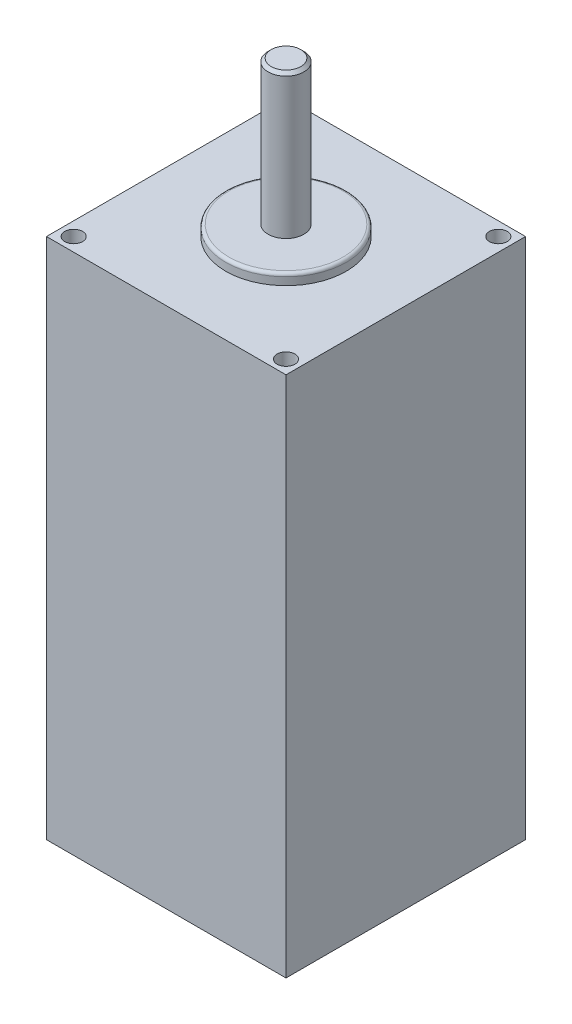
ISO-10303-21;
HEADER;
FILE_DESCRIPTION(('STEP AP214'),'2;1');
FILE_NAME('part.step','',(''),(''),'','','');
FILE_SCHEMA(('AUTOMOTIVE_DESIGN { 1 0 10303 214 1 1 1 1 }'));
ENDSEC;
DATA;
#1=APPLICATION_CONTEXT('core data for automotive mechanical design processes');
#2=APPLICATION_PROTOCOL_DEFINITION('international standard','automotive_design',2000,#1);
#3=PRODUCT_CONTEXT('',#1,'mechanical');
#4=PRODUCT('Part','Part','',(#3));
#5=PRODUCT_RELATED_PRODUCT_CATEGORY('part','',(#4));
#6=PRODUCT_DEFINITION_FORMATION('','',#4);
#7=PRODUCT_DEFINITION_CONTEXT('part definition',#1,'design');
#8=PRODUCT_DEFINITION('design','',#6,#7);
#9=PRODUCT_DEFINITION_SHAPE('','',#8);
#10=(LENGTH_UNIT() NAMED_UNIT(*) SI_UNIT(.MILLI.,.METRE.));
#11=(NAMED_UNIT(*) PLANE_ANGLE_UNIT() SI_UNIT($,.RADIAN.));
#12=(NAMED_UNIT(*) SI_UNIT($,.STERADIAN.) SOLID_ANGLE_UNIT());
#13=UNCERTAINTY_MEASURE_WITH_UNIT(LENGTH_MEASURE(1.E-05),#10,'distance_accuracy_value','');
#14=(GEOMETRIC_REPRESENTATION_CONTEXT(3) GLOBAL_UNCERTAINTY_ASSIGNED_CONTEXT((#13)) GLOBAL_UNIT_ASSIGNED_CONTEXT((#10,
#11,#12)) REPRESENTATION_CONTEXT('',''));
#15=CARTESIAN_POINT('',(0.,0.,0.));
#16=DIRECTION('',(0.,0.,1.));
#17=DIRECTION('',(1.,0.,0.));
#18=AXIS2_PLACEMENT_3D('',#15,#16,#17);
#19=CARTESIAN_POINT('',(0.,85.852,-39.37));
#20=DIRECTION('',(0.,1.,0.));
#21=DIRECTION('',(0.,0.,1.));
#22=AXIS2_PLACEMENT_3D('',#19,#20,#21);
#23=PLANE('',#22);
#24=CARTESIAN_POINT('',(2.23636235676263,85.852,-2.23636235676263));
#25=DIRECTION('',(0.,1.,0.));
#26=DIRECTION('',(0.,0.,1.));
#27=AXIS2_PLACEMENT_3D('',#24,#25,#26);
#28=CIRCLE('',#27,1.4605);
#29=CARTESIAN_POINT('',(2.23636235676263,85.852,-0.775862356762632));
#30=VERTEX_POINT('',#29);
#31=EDGE_CURVE('E209',#30,#30,#28,.T.);
#32=ORIENTED_EDGE('',*,*,#31,.F.);
#33=EDGE_LOOP('',(#32));
#34=FACE_BOUND('',#33,.T.);
#35=CARTESIAN_POINT('',(37.1336376432374,85.852,-2.23636235676264));
#36=DIRECTION('',(0.,1.,0.));
#37=DIRECTION('',(0.,0.,1.));
#38=AXIS2_PLACEMENT_3D('',#35,#36,#37);
#39=CIRCLE('',#38,1.46050000000001);
#40=CARTESIAN_POINT('',(37.1336376432374,85.852,-0.77586235676263));
#41=VERTEX_POINT('',#40);
#42=EDGE_CURVE('E203',#41,#41,#39,.T.);
#43=ORIENTED_EDGE('',*,*,#42,.F.);
#44=EDGE_LOOP('',(#43));
#45=FACE_BOUND('',#44,.T.);
#46=CARTESIAN_POINT('',(37.1336376432374,85.852,-37.1336376432374));
#47=DIRECTION('',(0.,1.,0.));
#48=DIRECTION('',(0.,0.,1.));
#49=AXIS2_PLACEMENT_3D('',#46,#47,#48);
#50=CIRCLE('',#49,1.46050000000001);
#51=CARTESIAN_POINT('',(37.1336376432374,85.852,-35.6731376432374));
#52=VERTEX_POINT('',#51);
#53=EDGE_CURVE('E197',#52,#52,#50,.T.);
#54=ORIENTED_EDGE('',*,*,#53,.F.);
#55=EDGE_LOOP('',(#54));
#56=FACE_BOUND('',#55,.T.);
#57=CARTESIAN_POINT('',(2.23636235676264,85.852,-37.1336376432374));
#58=DIRECTION('',(0.,1.,0.));
#59=DIRECTION('',(0.,0.,1.));
#60=AXIS2_PLACEMENT_3D('',#57,#58,#59);
#61=CIRCLE('',#60,1.4605);
#62=CARTESIAN_POINT('',(2.23636235676264,85.852,-35.6731376432374));
#63=VERTEX_POINT('',#62);
#64=EDGE_CURVE('E191',#63,#63,#61,.T.);
#65=ORIENTED_EDGE('',*,*,#64,.F.);
#66=EDGE_LOOP('',(#65));
#67=FACE_BOUND('',#66,.T.);
#68=DIRECTION('',(-1.,0.,0.));
#69=VECTOR('',#68,1.);
#70=CARTESIAN_POINT('',(0.,85.852,0.));
#71=LINE('',#70,#69);
#72=CARTESIAN_POINT('',(39.37,85.852,0.));
#73=VERTEX_POINT('',#72);
#74=CARTESIAN_POINT('',(0.,85.852,0.));
#75=VERTEX_POINT('',#74);
#76=EDGE_CURVE('E95',#73,#75,#71,.T.);
#77=ORIENTED_EDGE('',*,*,#76,.F.);
#78=DIRECTION('',(0.,0.,1.));
#79=VECTOR('',#78,1.);
#80=CARTESIAN_POINT('',(39.37,85.852,-39.37));
#81=LINE('',#80,#79);
#82=CARTESIAN_POINT('',(39.37,85.852,-39.37));
#83=VERTEX_POINT('',#82);
#84=EDGE_CURVE('E65',#83,#73,#81,.T.);
#85=ORIENTED_EDGE('',*,*,#84,.F.);
#86=DIRECTION('',(-1.,0.,0.));
#87=VECTOR('',#86,1.);
#88=CARTESIAN_POINT('',(0.,85.852,-39.37));
#89=LINE('',#88,#87);
#90=CARTESIAN_POINT('',(0.,85.852,-39.37));
#91=VERTEX_POINT('',#90);
#92=EDGE_CURVE('E90',#83,#91,#89,.T.);
#93=ORIENTED_EDGE('',*,*,#92,.T.);
#94=DIRECTION('',(0.,0.,1.));
#95=VECTOR('',#94,1.);
#96=CARTESIAN_POINT('',(0.,85.852,-39.37));
#97=LINE('',#96,#95);
#98=EDGE_CURVE('E48',#91,#75,#97,.T.);
#99=ORIENTED_EDGE('',*,*,#98,.T.);
#100=EDGE_LOOP('',(#77,#85,#93,#99));
#101=FACE_BOUND('',#100,.T.);
#102=CARTESIAN_POINT('',(19.685,85.852,-19.685));
#103=DIRECTION('',(0.,1.,0.));
#104=DIRECTION('',(0.,0.,1.));
#105=AXIS2_PLACEMENT_3D('',#102,#103,#104);
#106=CIRCLE('',#105,9.906);
#107=CARTESIAN_POINT('',(19.685,85.852,-9.779));
#108=VERTEX_POINT('',#107);
#109=EDGE_CURVE('E119',#108,#108,#106,.T.);
#110=ORIENTED_EDGE('',*,*,#109,.F.);
#111=EDGE_LOOP('',(#110));
#112=FACE_BOUND('',#111,.T.);
#113=ADVANCED_FACE('F31',(#34,#45,#56,#67,#101,#112),#23,.T.);
#114=CARTESIAN_POINT('',(0.,0.,-39.37));
#115=DIRECTION('',(-1.,0.,0.));
#116=DIRECTION('',(0.,0.,1.));
#117=AXIS2_PLACEMENT_3D('',#114,#115,#116);
#118=PLANE('',#117);
#119=DIRECTION('',(0.,-1.,0.));
#120=VECTOR('',#119,1.);
#121=CARTESIAN_POINT('',(0.,0.,0.));
#122=LINE('',#121,#120);
#123=CARTESIAN_POINT('',(0.,0.,0.));
#124=VERTEX_POINT('',#123);
#125=EDGE_CURVE('E100',#75,#124,#122,.T.);
#126=ORIENTED_EDGE('',*,*,#125,.F.);
#127=ORIENTED_EDGE('',*,*,#98,.F.);
#128=DIRECTION('',(0.,-1.,0.));
#129=VECTOR('',#128,1.);
#130=CARTESIAN_POINT('',(0.,0.,-39.37));
#131=LINE('',#130,#129);
#132=CARTESIAN_POINT('',(0.,0.,-39.37));
#133=VERTEX_POINT('',#132);
#134=EDGE_CURVE('E93',#91,#133,#131,.T.);
#135=ORIENTED_EDGE('',*,*,#134,.T.);
#136=DIRECTION('',(0.,0.,1.));
#137=VECTOR('',#136,1.);
#138=CARTESIAN_POINT('',(0.,0.,-39.37));
#139=LINE('',#138,#137);
#140=EDGE_CURVE('E76',#133,#124,#139,.T.);
#141=ORIENTED_EDGE('',*,*,#140,.T.);
#142=EDGE_LOOP('',(#126,#127,#135,#141));
#143=FACE_BOUND('',#142,.T.);
#144=ADVANCED_FACE('F142',(#143),#118,.T.);
#145=CARTESIAN_POINT('',(39.37,0.,-39.37));
#146=DIRECTION('',(1.,0.,0.));
#147=DIRECTION('',(0.,0.,-1.));
#148=AXIS2_PLACEMENT_3D('',#145,#146,#147);
#149=PLANE('',#148);
#150=DIRECTION('',(0.,1.,0.));
#151=VECTOR('',#150,1.);
#152=CARTESIAN_POINT('',(39.37,0.,0.));
#153=LINE('',#152,#151);
#154=CARTESIAN_POINT('',(39.37,0.,0.));
#155=VERTEX_POINT('',#154);
#156=EDGE_CURVE('E84',#155,#73,#153,.T.);
#157=ORIENTED_EDGE('',*,*,#156,.F.);
#158=DIRECTION('',(0.,0.,1.));
#159=VECTOR('',#158,1.);
#160=CARTESIAN_POINT('',(39.37,0.,-39.37));
#161=LINE('',#160,#159);
#162=CARTESIAN_POINT('',(39.37,0.,-39.37));
#163=VERTEX_POINT('',#162);
#164=EDGE_CURVE('E79',#163,#155,#161,.T.);
#165=ORIENTED_EDGE('',*,*,#164,.F.);
#166=DIRECTION('',(0.,1.,0.));
#167=VECTOR('',#166,1.);
#168=CARTESIAN_POINT('',(39.37,0.,-39.37));
#169=LINE('',#168,#167);
#170=EDGE_CURVE('E82',#163,#83,#169,.T.);
#171=ORIENTED_EDGE('',*,*,#170,.T.);
#172=ORIENTED_EDGE('',*,*,#84,.T.);
#173=EDGE_LOOP('',(#157,#165,#171,#172));
#174=FACE_BOUND('',#173,.T.);
#175=ADVANCED_FACE('F81',(#174),#149,.T.);
#176=CARTESIAN_POINT('',(0.,0.,-39.37));
#177=DIRECTION('',(0.,-1.,0.));
#178=DIRECTION('',(0.,0.,-1.));
#179=AXIS2_PLACEMENT_3D('',#176,#177,#178);
#180=PLANE('',#179);
#181=DIRECTION('',(1.,0.,0.));
#182=VECTOR('',#181,1.);
#183=CARTESIAN_POINT('',(0.,0.,0.));
#184=LINE('',#183,#182);
#185=EDGE_CURVE('E103',#124,#155,#184,.T.);
#186=ORIENTED_EDGE('',*,*,#185,.F.);
#187=ORIENTED_EDGE('',*,*,#140,.F.);
#188=DIRECTION('',(1.,0.,0.));
#189=VECTOR('',#188,1.);
#190=CARTESIAN_POINT('',(0.,0.,-39.37));
#191=LINE('',#190,#189);
#192=EDGE_CURVE('E89',#133,#163,#191,.T.);
#193=ORIENTED_EDGE('',*,*,#192,.T.);
#194=ORIENTED_EDGE('',*,*,#164,.T.);
#195=EDGE_LOOP('',(#186,#187,#193,#194));
#196=FACE_BOUND('',#195,.T.);
#197=ADVANCED_FACE('F92',(#196),#180,.T.);
#198=CARTESIAN_POINT('',(0.,85.852,-39.37));
#199=DIRECTION('',(0.,0.,-1.));
#200=DIRECTION('',(-1.,0.,0.));
#201=AXIS2_PLACEMENT_3D('',#198,#199,#200);
#202=PLANE('',#201);
#203=ORIENTED_EDGE('',*,*,#134,.F.);
#204=ORIENTED_EDGE('',*,*,#92,.F.);
#205=ORIENTED_EDGE('',*,*,#170,.F.);
#206=ORIENTED_EDGE('',*,*,#192,.F.);
#207=EDGE_LOOP('',(#203,#204,#205,#206));
#208=FACE_BOUND('',#207,.T.);
#209=ADVANCED_FACE('F88',(#208),#202,.T.);
#210=CARTESIAN_POINT('',(0.,85.852,0.));
#211=DIRECTION('',(0.,0.,-1.));
#212=DIRECTION('',(-1.,0.,0.));
#213=AXIS2_PLACEMENT_3D('',#210,#211,#212);
#214=PLANE('',#213);
#215=ORIENTED_EDGE('',*,*,#125,.T.);
#216=ORIENTED_EDGE('',*,*,#185,.T.);
#217=ORIENTED_EDGE('',*,*,#156,.T.);
#218=ORIENTED_EDGE('',*,*,#76,.T.);
#219=EDGE_LOOP('',(#215,#216,#217,#218));
#220=FACE_BOUND('',#219,.T.);
#221=ADVANCED_FACE('F153',(#220),#214,.F.);
#222=CARTESIAN_POINT('',(19.685,87.63,-19.685));
#223=DIRECTION('',(0.,1.,0.));
#224=DIRECTION('',(0.,0.,1.));
#225=AXIS2_PLACEMENT_3D('',#222,#223,#224);
#226=PLANE('',#225);
#227=CARTESIAN_POINT('',(19.685,87.63,-19.685));
#228=DIRECTION('',(0.,1.,0.));
#229=DIRECTION('',(0.,0.,1.));
#230=AXIS2_PLACEMENT_3D('',#227,#228,#229);
#231=CIRCLE('',#230,9.398);
#232=CARTESIAN_POINT('',(19.685,87.63,-10.287));
#233=VERTEX_POINT('',#232);
#234=EDGE_CURVE('E40',#233,#233,#231,.T.);
#235=ORIENTED_EDGE('',*,*,#234,.T.);
#236=EDGE_LOOP('',(#235));
#237=FACE_BOUND('',#236,.T.);
#238=CARTESIAN_POINT('',(19.685,87.63,-19.685));
#239=DIRECTION('',(0.,1.,0.));
#240=DIRECTION('',(0.,0.,1.));
#241=AXIS2_PLACEMENT_3D('',#238,#239,#240);
#242=CIRCLE('',#241,2.9337);
#243=CARTESIAN_POINT('',(19.685,87.63,-16.7513));
#244=VERTEX_POINT('',#243);
#245=EDGE_CURVE('E104',#244,#244,#242,.T.);
#246=ORIENTED_EDGE('',*,*,#245,.F.);
#247=EDGE_LOOP('',(#246));
#248=FACE_BOUND('',#247,.T.);
#249=ADVANCED_FACE('F123',(#237,#248),#226,.T.);
#250=CARTESIAN_POINT('',(19.685,87.63,-19.685));
#251=DIRECTION('',(0.,-1.,0.));
#252=DIRECTION('',(0.,0.,-1.));
#253=AXIS2_PLACEMENT_3D('',#250,#251,#252);
#254=CYLINDRICAL_SURFACE('',#253,9.906);
#255=CARTESIAN_POINT('',(19.685,87.122,-19.685));
#256=DIRECTION('',(0.,1.,0.));
#257=DIRECTION('',(0.,0.,1.));
#258=AXIS2_PLACEMENT_3D('',#255,#256,#257);
#259=CIRCLE('',#258,9.906);
#260=CARTESIAN_POINT('',(19.685,87.122,-9.779));
#261=VERTEX_POINT('',#260);
#262=EDGE_CURVE('E11',#261,#261,#259,.F.);
#263=ORIENTED_EDGE('',*,*,#262,.T.);
#264=EDGE_LOOP('',(#263));
#265=FACE_BOUND('',#264,.T.);
#266=ORIENTED_EDGE('',*,*,#109,.T.);
#267=EDGE_LOOP('',(#266));
#268=FACE_BOUND('',#267,.T.);
#269=ADVANCED_FACE('F164',(#265,#268),#254,.T.);
#270=CARTESIAN_POINT('',(19.685,111.252,-19.685));
#271=DIRECTION('',(0.,1.,0.));
#272=DIRECTION('',(0.,0.,1.));
#273=AXIS2_PLACEMENT_3D('',#270,#271,#272);
#274=PLANE('',#273);
#275=CARTESIAN_POINT('',(19.685,111.252,-19.685));
#276=DIRECTION('',(0.,1.,0.));
#277=DIRECTION('',(0.,0.,1.));
#278=AXIS2_PLACEMENT_3D('',#275,#276,#277);
#279=CIRCLE('',#278,2.42570000000004);
#280=CARTESIAN_POINT('',(19.685,111.252,-17.2593));
#281=VERTEX_POINT('',#280);
#282=EDGE_CURVE('E110',#281,#281,#279,.T.);
#283=ORIENTED_EDGE('',*,*,#282,.T.);
#284=EDGE_LOOP('',(#283));
#285=FACE_BOUND('',#284,.T.);
#286=ADVANCED_FACE('F159',(#285),#274,.T.);
#287=CARTESIAN_POINT('',(19.685,111.252,-19.685));
#288=DIRECTION('',(0.,-1.,0.));
#289=DIRECTION('',(0.,0.,-1.));
#290=AXIS2_PLACEMENT_3D('',#287,#288,#289);
#291=CONICAL_SURFACE('',#290,2.42570000000004,0.785398163397453);
#292=CARTESIAN_POINT('',(19.685,110.744,-19.685));
#293=DIRECTION('',(0.,1.,0.));
#294=DIRECTION('',(0.,0.,1.));
#295=AXIS2_PLACEMENT_3D('',#292,#293,#294);
#296=CIRCLE('',#295,2.9337);
#297=CARTESIAN_POINT('',(19.685,110.744,-16.7513));
#298=VERTEX_POINT('',#297);
#299=EDGE_CURVE('E115',#298,#298,#296,.F.);
#300=ORIENTED_EDGE('',*,*,#299,.F.);
#301=EDGE_LOOP('',(#300));
#302=FACE_BOUND('',#301,.T.);
#303=ORIENTED_EDGE('',*,*,#282,.F.);
#304=EDGE_LOOP('',(#303));
#305=FACE_BOUND('',#304,.T.);
#306=ADVANCED_FACE('F137',(#302,#305),#291,.T.);
#307=CARTESIAN_POINT('',(19.685,111.252,-19.685));
#308=DIRECTION('',(0.,-1.,0.));
#309=DIRECTION('',(0.,0.,-1.));
#310=AXIS2_PLACEMENT_3D('',#307,#308,#309);
#311=CYLINDRICAL_SURFACE('',#310,2.9337);
#312=ORIENTED_EDGE('',*,*,#245,.T.);
#313=EDGE_LOOP('',(#312));
#314=FACE_BOUND('',#313,.T.);
#315=ORIENTED_EDGE('',*,*,#299,.T.);
#316=EDGE_LOOP('',(#315));
#317=FACE_BOUND('',#316,.T.);
#318=ADVANCED_FACE('F128',(#314,#317),#311,.T.);
#319=CARTESIAN_POINT('',(19.685,87.122,-19.685));
#320=DIRECTION('',(0.,1.,0.));
#321=DIRECTION('',(0.,0.,1.));
#322=AXIS2_PLACEMENT_3D('',#319,#320,#321);
#323=TOROIDAL_SURFACE('',#322,9.398,0.508);
#324=ORIENTED_EDGE('',*,*,#262,.F.);
#325=EDGE_LOOP('',(#324));
#326=FACE_BOUND('',#325,.T.);
#327=ORIENTED_EDGE('',*,*,#234,.F.);
#328=EDGE_LOOP('',(#327));
#329=FACE_BOUND('',#328,.T.);
#330=ADVANCED_FACE('F33',(#326,#329),#323,.T.);
#331=CARTESIAN_POINT('',(2.23636235676264,73.152,-37.1336376432374));
#332=DIRECTION('',(0.,1.,0.));
#333=DIRECTION('',(0.,0.,1.));
#334=AXIS2_PLACEMENT_3D('',#331,#332,#333);
#335=CYLINDRICAL_SURFACE('',#334,1.4605);
#336=CARTESIAN_POINT('',(2.23636235676264,73.152,-37.1336376432374));
#337=DIRECTION('',(0.,1.,0.));
#338=DIRECTION('',(0.,0.,1.));
#339=AXIS2_PLACEMENT_3D('',#336,#337,#338);
#340=CIRCLE('',#339,1.4605);
#341=CARTESIAN_POINT('',(2.23636235676264,73.152,-35.6731376432374));
#342=VERTEX_POINT('',#341);
#343=EDGE_CURVE('E189',#342,#342,#340,.T.);
#344=ORIENTED_EDGE('',*,*,#343,.F.);
#345=EDGE_LOOP('',(#344));
#346=FACE_BOUND('',#345,.T.);
#347=ORIENTED_EDGE('',*,*,#64,.T.);
#348=EDGE_LOOP('',(#347));
#349=FACE_BOUND('',#348,.T.);
#350=ADVANCED_FACE('F127',(#346,#349),#335,.F.);
#351=CARTESIAN_POINT('',(2.23636235676264,73.152,-37.1336376432374));
#352=DIRECTION('',(0.,1.,0.));
#353=DIRECTION('',(0.,0.,1.));
#354=AXIS2_PLACEMENT_3D('',#351,#352,#353);
#355=PLANE('',#354);
#356=ORIENTED_EDGE('',*,*,#343,.T.);
#357=EDGE_LOOP('',(#356));
#358=FACE_BOUND('',#357,.T.);
#359=ADVANCED_FACE('F134',(#358),#355,.T.);
#360=CARTESIAN_POINT('',(37.1336376432374,73.152,-37.1336376432374));
#361=DIRECTION('',(0.,1.,0.));
#362=DIRECTION('',(0.,0.,1.));
#363=AXIS2_PLACEMENT_3D('',#360,#361,#362);
#364=CYLINDRICAL_SURFACE('',#363,1.46050000000001);
#365=CARTESIAN_POINT('',(37.1336376432374,73.152,-37.1336376432374));
#366=DIRECTION('',(0.,1.,0.));
#367=DIRECTION('',(0.,0.,1.));
#368=AXIS2_PLACEMENT_3D('',#365,#366,#367);
#369=CIRCLE('',#368,1.46050000000001);
#370=CARTESIAN_POINT('',(37.1336376432374,73.152,-35.6731376432374));
#371=VERTEX_POINT('',#370);
#372=EDGE_CURVE('E195',#371,#371,#369,.T.);
#373=ORIENTED_EDGE('',*,*,#372,.F.);
#374=EDGE_LOOP('',(#373));
#375=FACE_BOUND('',#374,.T.);
#376=ORIENTED_EDGE('',*,*,#53,.T.);
#377=EDGE_LOOP('',(#376));
#378=FACE_BOUND('',#377,.T.);
#379=ADVANCED_FACE('F237',(#375,#378),#364,.F.);
#380=CARTESIAN_POINT('',(37.1336376432374,73.152,-37.1336376432374));
#381=DIRECTION('',(0.,1.,0.));
#382=DIRECTION('',(0.,0.,1.));
#383=AXIS2_PLACEMENT_3D('',#380,#381,#382);
#384=PLANE('',#383);
#385=ORIENTED_EDGE('',*,*,#372,.T.);
#386=EDGE_LOOP('',(#385));
#387=FACE_BOUND('',#386,.T.);
#388=ADVANCED_FACE('F233',(#387),#384,.T.);
#389=CARTESIAN_POINT('',(37.1336376432374,73.152,-2.23636235676264));
#390=DIRECTION('',(0.,1.,0.));
#391=DIRECTION('',(0.,0.,1.));
#392=AXIS2_PLACEMENT_3D('',#389,#390,#391);
#393=CYLINDRICAL_SURFACE('',#392,1.46050000000001);
#394=CARTESIAN_POINT('',(37.1336376432374,73.152,-2.23636235676264));
#395=DIRECTION('',(0.,1.,0.));
#396=DIRECTION('',(0.,0.,1.));
#397=AXIS2_PLACEMENT_3D('',#394,#395,#396);
#398=CIRCLE('',#397,1.46050000000001);
#399=CARTESIAN_POINT('',(37.1336376432374,73.152,-0.77586235676263));
#400=VERTEX_POINT('',#399);
#401=EDGE_CURVE('E200',#400,#400,#398,.T.);
#402=ORIENTED_EDGE('',*,*,#401,.F.);
#403=EDGE_LOOP('',(#402));
#404=FACE_BOUND('',#403,.T.);
#405=ORIENTED_EDGE('',*,*,#42,.T.);
#406=EDGE_LOOP('',(#405));
#407=FACE_BOUND('',#406,.T.);
#408=ADVANCED_FACE('F227',(#404,#407),#393,.F.);
#409=CARTESIAN_POINT('',(37.1336376432374,73.152,-2.23636235676264));
#410=DIRECTION('',(0.,1.,0.));
#411=DIRECTION('',(0.,0.,1.));
#412=AXIS2_PLACEMENT_3D('',#409,#410,#411);
#413=PLANE('',#412);
#414=ORIENTED_EDGE('',*,*,#401,.T.);
#415=EDGE_LOOP('',(#414));
#416=FACE_BOUND('',#415,.T.);
#417=ADVANCED_FACE('F220',(#416),#413,.T.);
#418=CARTESIAN_POINT('',(2.23636235676263,73.152,-2.23636235676263));
#419=DIRECTION('',(0.,1.,0.));
#420=DIRECTION('',(0.,0.,1.));
#421=AXIS2_PLACEMENT_3D('',#418,#419,#420);
#422=CYLINDRICAL_SURFACE('',#421,1.4605);
#423=CARTESIAN_POINT('',(2.23636235676263,73.152,-2.23636235676263));
#424=DIRECTION('',(0.,1.,0.));
#425=DIRECTION('',(0.,0.,1.));
#426=AXIS2_PLACEMENT_3D('',#423,#424,#425);
#427=CIRCLE('',#426,1.4605);
#428=CARTESIAN_POINT('',(2.23636235676263,73.152,-0.775862356762632));
#429=VERTEX_POINT('',#428);
#430=EDGE_CURVE('E206',#429,#429,#427,.T.);
#431=ORIENTED_EDGE('',*,*,#430,.F.);
#432=EDGE_LOOP('',(#431));
#433=FACE_BOUND('',#432,.T.);
#434=ORIENTED_EDGE('',*,*,#31,.T.);
#435=EDGE_LOOP('',(#434));
#436=FACE_BOUND('',#435,.T.);
#437=ADVANCED_FACE('F217',(#433,#436),#422,.F.);
#438=CARTESIAN_POINT('',(2.23636235676263,73.152,-2.23636235676263));
#439=DIRECTION('',(0.,1.,0.));
#440=DIRECTION('',(0.,0.,1.));
#441=AXIS2_PLACEMENT_3D('',#438,#439,#440);
#442=PLANE('',#441);
#443=ORIENTED_EDGE('',*,*,#430,.T.);
#444=EDGE_LOOP('',(#443));
#445=FACE_BOUND('',#444,.T.);
#446=ADVANCED_FACE('F215',(#445),#442,.T.);
#447=CLOSED_SHELL('',(#113,#144,#175,#197,#209,#221,#249,#269,#286,#306,#318,#330,#350,#359,
#379,#388,#408,#417,#437,#446));
#448=MANIFOLD_SOLID_BREP('B2',#447);
#449=ADVANCED_BREP_SHAPE_REPRESENTATION('',(#18,#448),#14);
#450=SHAPE_DEFINITION_REPRESENTATION(#9,#449);
ENDSEC;
END-ISO-10303-21;
